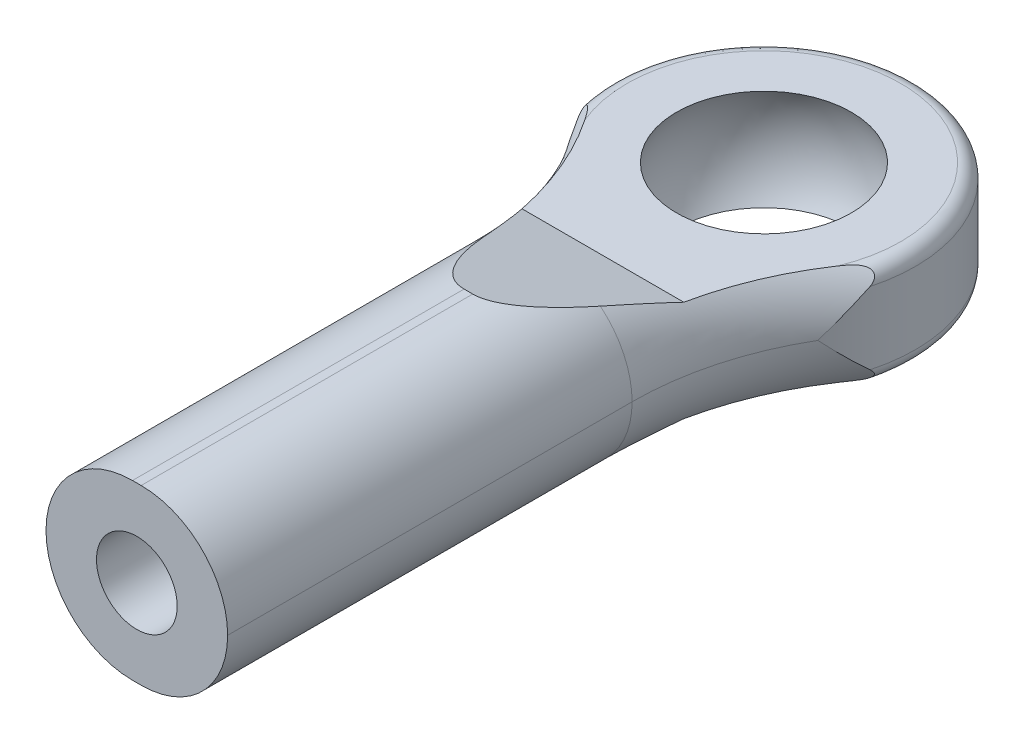
ISO-10303-21;
HEADER;
FILE_DESCRIPTION(('STEP AP214'),'2;1');
FILE_NAME('part.step','',(''),(''),'','','');
FILE_SCHEMA(('AUTOMOTIVE_DESIGN { 1 0 10303 214 1 1 1 1 }'));
ENDSEC;
DATA;
#1=APPLICATION_CONTEXT('core data for automotive mechanical design processes');
#2=APPLICATION_PROTOCOL_DEFINITION('international standard','automotive_design',2000,#1);
#3=PRODUCT_CONTEXT('',#1,'mechanical');
#4=PRODUCT('Part','Part','',(#3));
#5=PRODUCT_RELATED_PRODUCT_CATEGORY('part','',(#4));
#6=PRODUCT_DEFINITION_FORMATION('','',#4);
#7=PRODUCT_DEFINITION_CONTEXT('part definition',#1,'design');
#8=PRODUCT_DEFINITION('design','',#6,#7);
#9=PRODUCT_DEFINITION_SHAPE('','',#8);
#10=(LENGTH_UNIT() NAMED_UNIT(*) SI_UNIT(.MILLI.,.METRE.));
#11=(NAMED_UNIT(*) PLANE_ANGLE_UNIT() SI_UNIT($,.RADIAN.));
#12=(NAMED_UNIT(*) SI_UNIT($,.STERADIAN.) SOLID_ANGLE_UNIT());
#13=UNCERTAINTY_MEASURE_WITH_UNIT(LENGTH_MEASURE(1.E-05),#10,'distance_accuracy_value','');
#14=(GEOMETRIC_REPRESENTATION_CONTEXT(3) GLOBAL_UNCERTAINTY_ASSIGNED_CONTEXT((#13)) GLOBAL_UNIT_ASSIGNED_CONTEXT((#10,
#11,#12)) REPRESENTATION_CONTEXT('',''));
#15=CARTESIAN_POINT('',(0.,0.,0.));
#16=DIRECTION('',(0.,0.,1.));
#17=DIRECTION('',(1.,0.,0.));
#18=AXIS2_PLACEMENT_3D('',#15,#16,#17);
#19=CARTESIAN_POINT('',(0.,3.,0.));
#20=DIRECTION('',(0.,-1.,0.));
#21=DIRECTION('',(0.,0.,-1.));
#22=AXIS2_PLACEMENT_3D('',#19,#20,#21);
#23=CYLINDRICAL_SURFACE('',#22,5.25);
#24=CARTESIAN_POINT('',(5.19236330788863,-1.75,0.775798478273713));
#25=CARTESIAN_POINT('',(5.1792060495885,-1.68319756808274,0.863803332148237));
#26=CARTESIAN_POINT('',(5.16397328935948,-1.6151171445927,0.950501368957418));
#27=CARTESIAN_POINT('',(5.12958951395003,-1.47683559449729,1.1213492053765));
#28=CARTESIAN_POINT('',(5.11043977497422,-1.4066351649523,1.20549982474363));
#29=CARTESIAN_POINT('',(5.06845971366842,-1.26455151885504,1.37132093149753));
#30=CARTESIAN_POINT('',(5.0456318148596,-1.19266943681246,1.45299301016072));
#31=CARTESIAN_POINT('',(4.99645143942483,-1.04752411915998,1.6140192026978));
#32=CARTESIAN_POINT('',(4.97009866492158,-0.974260767272854,1.69337311997912));
#33=CARTESIAN_POINT('',(4.88654424944057,-0.75442988984834,1.92646711768173));
#34=CARTESIAN_POINT('',(4.82439563126691,-0.60630429059596,2.07698892977481));
#35=CARTESIAN_POINT('',(4.68739859515396,-0.308112202894216,2.37000675372814));
#36=CARTESIAN_POINT('',(4.61255402579669,-0.15804631531044,2.51250518037031));
#37=CARTESIAN_POINT('',(4.5299431354514,-0.00533840710561873,2.65369992634006));
#38=CARTESIAN_POINT('',(4.5284971582778,-0.00266919637831573,2.65616671056459));
#39=CARTESIAN_POINT('',(4.52704918032787,0.,2.65863230231124));
#40=B_SPLINE_CURVE_WITH_KNOTS('',3,(#24,#25,#26,#27,#28,#29,#30,#31,#32,#33,#34,#35,#36,#37,#38,
#39),.UNSPECIFIED.,.F.,.F.,(4,2,2,2,2,2,2,4),(0.,0.333738494978038,0.667368426154714,
1.00077942248185,1.33421861225407,1.99403824894354,2.65365822774091,2.66539300371591),.UNSPECIFIED.);
#41=CARTESIAN_POINT('',(4.52704918032787,0.,2.65863230231124));
#42=VERTEX_POINT('',#41);
#43=CARTESIAN_POINT('',(5.06340015992934,-1.25,1.38725585975607));
#44=VERTEX_POINT('',#43);
#45=EDGE_CURVE('E271',#42,#44,#40,.F.);
#46=ORIENTED_EDGE('',*,*,#45,.T.);
#47=CARTESIAN_POINT('',(0.,-1.25,0.));
#48=DIRECTION('',(0.,-1.,0.));
#49=DIRECTION('',(0.,0.,-1.));
#50=AXIS2_PLACEMENT_3D('',#47,#48,#49);
#51=CIRCLE('',#50,5.25);
#52=CARTESIAN_POINT('',(-5.06340015992934,-1.25,1.38725585975607));
#53=VERTEX_POINT('',#52);
#54=EDGE_CURVE('E334',#44,#53,#51,.F.);
#55=ORIENTED_EDGE('',*,*,#54,.T.);
#56=CARTESIAN_POINT('',(-5.19236330788863,-1.75,0.775798478273705));
#57=CARTESIAN_POINT('',(-5.17920604958849,-1.68319756808272,0.863803332148298));
#58=CARTESIAN_POINT('',(-5.16397328935946,-1.61511714459263,0.950501368957524));
#59=CARTESIAN_POINT('',(-5.12958951395,-1.47683559449713,1.12134920537668));
#60=CARTESIAN_POINT('',(-5.11043977497417,-1.40663516495209,1.20549982474384));
#61=CARTESIAN_POINT('',(-5.06845971366836,-1.26455151885488,1.37132093149774));
#62=CARTESIAN_POINT('',(-5.04563181485954,-1.1926694368124,1.45299301016088));
#63=CARTESIAN_POINT('',(-4.99645143942485,-1.04752411915993,1.61401920269776));
#64=CARTESIAN_POINT('',(-4.97009866492168,-0.974260767272721,1.69337311997892));
#65=CARTESIAN_POINT('',(-4.88654424944043,-0.754429889848801,1.92646711768193));
#66=CARTESIAN_POINT('',(-4.82439563126601,-0.606304290598025,2.07698892977632));
#67=CARTESIAN_POINT('',(-4.68739859515492,-0.308112202892274,2.37000675372651));
#68=CARTESIAN_POINT('',(-4.61255402580027,-0.158046315302889,2.51250518036422));
#69=CARTESIAN_POINT('',(-4.52994313545152,-0.00533840710533392,2.65369992633986));
#70=CARTESIAN_POINT('',(-4.52849715827786,-0.00266919637817126,2.65616671056449));
#71=CARTESIAN_POINT('',(-4.52704918032787,0.,2.65863230231124));
#72=B_SPLINE_CURVE_WITH_KNOTS('',3,(#56,#57,#58,#59,#60,#61,#62,#63,#64,#65,#66,#67,#68,#69,#70,
#71),.UNSPECIFIED.,.F.,.F.,(4,2,2,2,2,2,2,4),(0.,0.33373849497824,0.667368426155072,
1.00077942248195,1.33421861225392,1.99403824894344,2.65365822774096,2.66539300371591),.UNSPECIFIED.);
#73=CARTESIAN_POINT('',(-4.52704918032787,0.,2.65863230231124));
#74=VERTEX_POINT('',#73);
#75=EDGE_CURVE('E278',#53,#74,#72,.T.);
#76=ORIENTED_EDGE('',*,*,#75,.T.);
#77=CARTESIAN_POINT('',(-5.19236330788864,1.75,0.7757984782737));
#78=CARTESIAN_POINT('',(-5.17920604958851,1.68319756808276,0.863803332148192));
#79=CARTESIAN_POINT('',(-5.16397328935949,1.61511714459275,0.950501368957346));
#80=CARTESIAN_POINT('',(-5.12958951395006,1.47683559449739,1.12134920537638));
#81=CARTESIAN_POINT('',(-5.11043977497425,1.40663516495242,1.20549982474349));
#82=CARTESIAN_POINT('',(-5.06845971366846,1.26455151885514,1.3713209314974));
#83=CARTESIAN_POINT('',(-5.04563181485964,1.19266943681251,1.45299301016061));
#84=CARTESIAN_POINT('',(-4.99645143942482,1.04752411916002,1.61401920269781));
#85=CARTESIAN_POINT('',(-4.97009866492152,0.97426076727294,1.69337311997924));
#86=CARTESIAN_POINT('',(-4.88654424944065,0.754429889848075,1.92646711768161));
#87=CARTESIAN_POINT('',(-4.82439563126743,0.606304290594754,2.07698892977392));
#88=CARTESIAN_POINT('',(-4.6873985951534,0.308112202895366,2.37000675372911));
#89=CARTESIAN_POINT('',(-4.61255402579459,0.158046315314888,2.5125051803739));
#90=CARTESIAN_POINT('',(-4.52994313545133,0.00533840710578611,2.65369992634017));
#91=CARTESIAN_POINT('',(-4.52849715827776,0.00266919637840063,2.65616671056465));
#92=CARTESIAN_POINT('',(-4.52704918032787,0.,2.65863230231124));
#93=B_SPLINE_CURVE_WITH_KNOTS('',3,(#77,#78,#79,#80,#81,#82,#83,#84,#85,#86,#87,#88,#89,#90,#91,
#92),.UNSPECIFIED.,.F.,.F.,(4,2,2,2,2,2,2,4),(0.,0.333738494977921,0.667368426154508,
1.0007794224818,1.33421861225417,1.99403824894361,2.6536582277409,2.66539300371592),.UNSPECIFIED.);
#94=CARTESIAN_POINT('',(-5.06340015992934,1.25,1.38725585975607));
#95=VERTEX_POINT('',#94);
#96=EDGE_CURVE('E253',#74,#95,#93,.F.);
#97=ORIENTED_EDGE('',*,*,#96,.T.);
#98=CARTESIAN_POINT('',(0.,1.25,0.));
#99=DIRECTION('',(0.,1.,0.));
#100=DIRECTION('',(0.,0.,1.));
#101=AXIS2_PLACEMENT_3D('',#98,#99,#100);
#102=CIRCLE('',#101,5.25);
#103=CARTESIAN_POINT('',(5.06340015992934,1.25,1.38725585975607));
#104=VERTEX_POINT('',#103);
#105=EDGE_CURVE('E375',#95,#104,#102,.F.);
#106=ORIENTED_EDGE('',*,*,#105,.T.);
#107=CARTESIAN_POINT('',(5.19236330788864,1.75,0.775798478273701));
#108=CARTESIAN_POINT('',(5.17920604958849,1.68319756808272,0.863803332148299));
#109=CARTESIAN_POINT('',(5.16397328935946,1.61511714459262,0.950501368957527));
#110=CARTESIAN_POINT('',(5.12958951395,1.47683559449712,1.12134920537669));
#111=CARTESIAN_POINT('',(5.11043977497417,1.40663516495208,1.20549982474385));
#112=CARTESIAN_POINT('',(5.06845971366836,1.26455151885488,1.37132093149775));
#113=CARTESIAN_POINT('',(5.04563181485953,1.19266943681239,1.45299301016089));
#114=CARTESIAN_POINT('',(4.99645143942485,1.04752411915993,1.61401920269776));
#115=CARTESIAN_POINT('',(4.97009866492169,0.974260767272713,1.69337311997891));
#116=CARTESIAN_POINT('',(4.88654424944043,0.754429889848821,1.92646711768194));
#117=CARTESIAN_POINT('',(4.82439563126596,0.606304290598131,2.0769889297764));
#118=CARTESIAN_POINT('',(4.68739859515497,0.308112202892173,2.37000675372643));
#119=CARTESIAN_POINT('',(4.61255402580046,0.158046315302497,2.5125051803639));
#120=CARTESIAN_POINT('',(4.52994313545152,0.00533840710531954,2.65369992633985));
#121=CARTESIAN_POINT('',(4.52849715827786,0.00266919637816396,2.65616671056448));
#122=CARTESIAN_POINT('',(4.52704918032787,0.,2.65863230231124));
#123=B_SPLINE_CURVE_WITH_KNOTS('',3,(#107,#108,#109,#110,#111,#112,#113,#114,#115,#116,#117,
#118,#119,#120,#121,#122),.UNSPECIFIED.,.F.,.F.,(4,2,2,2,2,2,2,4),(0.,0.333738494978251,
0.66736842615509,1.00077942248195,1.33421861225392,1.99403824894344,2.65365822774096,
2.66539300371592),.UNSPECIFIED.);
#124=EDGE_CURVE('E246',#104,#42,#123,.T.);
#125=ORIENTED_EDGE('',*,*,#124,.T.);
#126=EDGE_LOOP('',(#46,#55,#76,#97,#106,#125));
#127=FACE_BOUND('',#126,.T.);
#128=ADVANCED_FACE('F43',(#127),#23,.T.);
#129=CARTESIAN_POINT('',(0.,-3.,0.));
#130=DIRECTION('',(0.,-1.,0.));
#131=DIRECTION('',(0.,0.,1.));
#132=AXIS2_PLACEMENT_3D('',#129,#130,#131);
#133=PLANE('',#132);
#134=DIRECTION('',(1.,0.,0.));
#135=VECTOR('',#134,1.);
#136=CARTESIAN_POINT('',(-3.15,-3.,21.75));
#137=LINE('',#136,#135);
#138=CARTESIAN_POINT('',(-0.15,-3.,21.75));
#139=VERTEX_POINT('',#138);
#140=CARTESIAN_POINT('',(0.15,-3.,21.75));
#141=VERTEX_POINT('',#140);
#142=EDGE_CURVE('E167',#139,#141,#137,.T.);
#143=ORIENTED_EDGE('',*,*,#142,.F.);
#144=DIRECTION('',(0.,0.,1.));
#145=VECTOR('',#144,1.);
#146=CARTESIAN_POINT('',(-0.150000000000004,-3.,0.));
#147=LINE('',#146,#145);
#148=CARTESIAN_POINT('',(-0.150000000000002,-3.,10.25));
#149=VERTEX_POINT('',#148);
#150=EDGE_CURVE('E305',#139,#149,#147,.F.);
#151=ORIENTED_EDGE('',*,*,#150,.T.);
#152=DIRECTION('',(1.,0.,0.));
#153=VECTOR('',#152,1.);
#154=CARTESIAN_POINT('',(0.,-3.,10.25));
#155=LINE('',#154,#153);
#156=CARTESIAN_POINT('',(0.150000000000002,-3.,10.25));
#157=VERTEX_POINT('',#156);
#158=EDGE_CURVE('E406',#149,#157,#155,.T.);
#159=ORIENTED_EDGE('',*,*,#158,.T.);
#160=DIRECTION('',(0.,0.,-1.));
#161=VECTOR('',#160,1.);
#162=CARTESIAN_POINT('',(0.150000000000004,-3.,0.));
#163=LINE('',#162,#161);
#164=EDGE_CURVE('E416',#157,#141,#163,.F.);
#165=ORIENTED_EDGE('',*,*,#164,.T.);
#166=EDGE_LOOP('',(#143,#151,#159,#165));
#167=FACE_BOUND('',#166,.T.);
#168=ADVANCED_FACE('F263',(#167),#133,.T.);
#169=CARTESIAN_POINT('',(-3.15,3.,21.75));
#170=DIRECTION('',(0.,0.,-1.));
#171=DIRECTION('',(-1.,0.,0.));
#172=AXIS2_PLACEMENT_3D('',#169,#170,#171);
#173=PLANE('',#172);
#174=CARTESIAN_POINT('',(0.,0.,21.75));
#175=DIRECTION('',(0.,0.,1.));
#176=DIRECTION('',(1.,0.,0.));
#177=AXIS2_PLACEMENT_3D('',#174,#175,#176);
#178=CIRCLE('',#177,1.4);
#179=CARTESIAN_POINT('',(1.4,0.,21.75));
#180=VERTEX_POINT('',#179);
#181=EDGE_CURVE('E352',#180,#180,#178,.T.);
#182=ORIENTED_EDGE('',*,*,#181,.F.);
#183=EDGE_LOOP('',(#182));
#184=FACE_BOUND('',#183,.T.);
#185=CARTESIAN_POINT('',(-0.15,0.,21.75));
#186=DIRECTION('',(0.,0.,-1.));
#187=DIRECTION('',(-1.,0.,0.));
#188=AXIS2_PLACEMENT_3D('',#185,#186,#187);
#189=CIRCLE('',#188,3.);
#190=CARTESIAN_POINT('',(-0.15,3.,21.75));
#191=VERTEX_POINT('',#190);
#192=CARTESIAN_POINT('',(-3.15,0.,21.75));
#193=VERTEX_POINT('',#192);
#194=EDGE_CURVE('E183',#191,#193,#189,.F.);
#195=ORIENTED_EDGE('',*,*,#194,.T.);
#196=CARTESIAN_POINT('',(-0.15,0.,21.75));
#197=DIRECTION('',(0.,0.,-1.));
#198=DIRECTION('',(-1.,0.,0.));
#199=AXIS2_PLACEMENT_3D('',#196,#197,#198);
#200=CIRCLE('',#199,3.);
#201=EDGE_CURVE('E171',#193,#139,#200,.F.);
#202=ORIENTED_EDGE('',*,*,#201,.T.);
#203=ORIENTED_EDGE('',*,*,#142,.T.);
#204=CARTESIAN_POINT('',(0.15,0.,21.75));
#205=DIRECTION('',(0.,0.,-1.));
#206=DIRECTION('',(-1.,0.,0.));
#207=AXIS2_PLACEMENT_3D('',#204,#205,#206);
#208=CIRCLE('',#207,3.);
#209=CARTESIAN_POINT('',(3.15,0.,21.75));
#210=VERTEX_POINT('',#209);
#211=EDGE_CURVE('E160',#141,#210,#208,.F.);
#212=ORIENTED_EDGE('',*,*,#211,.T.);
#213=CARTESIAN_POINT('',(0.15,0.,21.75));
#214=DIRECTION('',(0.,0.,-1.));
#215=DIRECTION('',(-1.,0.,0.));
#216=AXIS2_PLACEMENT_3D('',#213,#214,#215);
#217=CIRCLE('',#216,3.);
#218=CARTESIAN_POINT('',(0.15,3.,21.75));
#219=VERTEX_POINT('',#218);
#220=EDGE_CURVE('E164',#210,#219,#217,.F.);
#221=ORIENTED_EDGE('',*,*,#220,.T.);
#222=DIRECTION('',(1.,0.,0.));
#223=VECTOR('',#222,1.);
#224=CARTESIAN_POINT('',(-3.15,3.,21.75));
#225=LINE('',#224,#223);
#226=EDGE_CURVE('E191',#191,#219,#225,.T.);
#227=ORIENTED_EDGE('',*,*,#226,.F.);
#228=EDGE_LOOP('',(#195,#202,#203,#212,#221,#227));
#229=FACE_BOUND('',#228,.T.);
#230=ADVANCED_FACE('F162',(#184,#229),#173,.F.);
#231=CARTESIAN_POINT('',(0.,3.,0.));
#232=DIRECTION('',(0.,1.,0.));
#233=DIRECTION('',(0.,0.,1.));
#234=AXIS2_PLACEMENT_3D('',#231,#232,#233);
#235=PLANE('',#234);
#236=DIRECTION('',(-1.,0.,0.));
#237=VECTOR('',#236,1.);
#238=CARTESIAN_POINT('',(-3.46053225298248,3.,10.25));
#239=LINE('',#238,#237);
#240=CARTESIAN_POINT('',(0.150000000000002,3.,10.25));
#241=VERTEX_POINT('',#240);
#242=CARTESIAN_POINT('',(-0.150000000000002,3.,10.25));
#243=VERTEX_POINT('',#242);
#244=EDGE_CURVE('E207',#241,#243,#239,.T.);
#245=ORIENTED_EDGE('',*,*,#244,.T.);
#246=DIRECTION('',(0.,0.,1.));
#247=VECTOR('',#246,1.);
#248=CARTESIAN_POINT('',(-0.15,3.,21.75));
#249=LINE('',#248,#247);
#250=EDGE_CURVE('E184',#243,#191,#249,.T.);
#251=ORIENTED_EDGE('',*,*,#250,.T.);
#252=ORIENTED_EDGE('',*,*,#226,.T.);
#253=DIRECTION('',(0.,0.,-1.));
#254=VECTOR('',#253,1.);
#255=CARTESIAN_POINT('',(0.150000000000002,3.,10.25));
#256=LINE('',#255,#254);
#257=EDGE_CURVE('E182',#219,#241,#256,.T.);
#258=ORIENTED_EDGE('',*,*,#257,.T.);
#259=EDGE_LOOP('',(#245,#251,#252,#258));
#260=FACE_BOUND('',#259,.T.);
#261=ADVANCED_FACE('F428',(#260),#235,.T.);
#262=CARTESIAN_POINT('',(0.,1.75,0.));
#263=DIRECTION('',(0.,1.,0.));
#264=DIRECTION('',(0.,0.,1.));
#265=AXIS2_PLACEMENT_3D('',#262,#263,#264);
#266=PLANE('',#265);
#267=CARTESIAN_POINT('',(0.,1.75,0.));
#268=DIRECTION('',(0.,1.,0.));
#269=DIRECTION('',(0.,0.,1.));
#270=AXIS2_PLACEMENT_3D('',#267,#268,#269);
#271=CIRCLE('',#270,3.03108891324554);
#272=CARTESIAN_POINT('',(0.,1.75,-3.03108891324554));
#273=VERTEX_POINT('',#272);
#274=EDGE_CURVE('E194',#273,#273,#271,.F.);
#275=ORIENTED_EDGE('',*,*,#274,.T.);
#276=EDGE_LOOP('',(#275));
#277=FACE_BOUND('',#276,.T.);
#278=CARTESIAN_POINT('',(13.15,1.75,7.72269383052313));
#279=DIRECTION('',(0.,1.,0.));
#280=DIRECTION('',(0.,0.,1.));
#281=AXIS2_PLACEMENT_3D('',#278,#279,#280);
#282=CIRCLE('',#281,10.5633014137978);
#283=CARTESIAN_POINT('',(2.80527524222679,1.75,5.58493649053905));
#284=VERTEX_POINT('',#283);
#285=CARTESIAN_POINT('',(4.38380171285945,1.75,1.82887466556092));
#286=VERTEX_POINT('',#285);
#287=EDGE_CURVE('E395',#284,#286,#282,.F.);
#288=ORIENTED_EDGE('',*,*,#287,.T.);
#289=CARTESIAN_POINT('',(0.,1.75,0.));
#290=DIRECTION('',(0.,1.,0.));
#291=DIRECTION('',(0.,0.,1.));
#292=AXIS2_PLACEMENT_3D('',#289,#290,#291);
#293=CIRCLE('',#292,4.75);
#294=CARTESIAN_POINT('',(-4.38380171285945,1.75,1.82887466556092));
#295=VERTEX_POINT('',#294);
#296=EDGE_CURVE('E366',#286,#295,#293,.T.);
#297=ORIENTED_EDGE('',*,*,#296,.T.);
#298=CARTESIAN_POINT('',(-13.15,1.75,7.72269383052313));
#299=DIRECTION('',(0.,1.,0.));
#300=DIRECTION('',(0.,0.,1.));
#301=AXIS2_PLACEMENT_3D('',#298,#299,#300);
#302=CIRCLE('',#301,10.5633014137978);
#303=CARTESIAN_POINT('',(-2.8052752422268,1.75,5.58493649053905));
#304=VERTEX_POINT('',#303);
#305=EDGE_CURVE('E364',#295,#304,#302,.F.);
#306=ORIENTED_EDGE('',*,*,#305,.T.);
#307=DIRECTION('',(1.,0.,0.));
#308=VECTOR('',#307,1.);
#309=CARTESIAN_POINT('',(-3.15,1.75,5.58493649053905));
#310=LINE('',#309,#308);
#311=EDGE_CURVE('E210',#304,#284,#310,.T.);
#312=ORIENTED_EDGE('',*,*,#311,.T.);
#313=EDGE_LOOP('',(#288,#297,#306,#312));
#314=FACE_BOUND('',#313,.T.);
#315=ADVANCED_FACE('F430',(#277,#314),#266,.T.);
#316=CARTESIAN_POINT('',(0.,0.,0.));
#317=DIRECTION('',(0.,1.,0.));
#318=DIRECTION('',(0.,0.,-1.));
#319=AXIS2_PLACEMENT_3D('',#316,#317,#318);
#320=SPHERICAL_SURFACE('',#319,3.5);
#321=CARTESIAN_POINT('',(0.,0.,0.));
#322=DIRECTION('',(1.,0.,0.));
#323=DIRECTION('',(0.,0.,-1.));
#324=AXIS2_PLACEMENT_3D('',#321,#322,#323);
#325=CIRCLE('',#324,3.5);
#326=CARTESIAN_POINT('',(0.,-1.75,-3.03108891324554));
#327=VERTEX_POINT('',#326);
#328=EDGE_CURVE('E197',#327,#273,#325,.T.);
#329=ORIENTED_EDGE('',*,*,#328,.F.);
#330=CARTESIAN_POINT('',(0.,-1.75,0.));
#331=DIRECTION('',(0.,-1.,0.));
#332=DIRECTION('',(0.,0.,-1.));
#333=AXIS2_PLACEMENT_3D('',#330,#331,#332);
#334=CIRCLE('',#333,3.03108891324554);
#335=EDGE_CURVE('E404',#327,#327,#334,.F.);
#336=ORIENTED_EDGE('',*,*,#335,.F.);
#337=ORIENTED_EDGE('',*,*,#328,.T.);
#338=ORIENTED_EDGE('',*,*,#274,.F.);
#339=EDGE_LOOP('',(#329,#336,#337,#338));
#340=FACE_BOUND('',#339,.T.);
#341=ADVANCED_FACE('F435',(#340),#320,.F.);
#342=CARTESIAN_POINT('',(-3.15,1.66025403784435,5.25));
#343=DIRECTION('',(0.,0.965925826289066,-0.258819045102528));
#344=DIRECTION('',(-1.,0.,0.));
#345=AXIS2_PLACEMENT_3D('',#342,#343,#344);
#346=PLANE('',#345);
#347=CARTESIAN_POINT('',(-2.8052752422268,1.75,5.58493649053905));
#348=CARTESIAN_POINT('',(-2.73446276507972,1.79703130626624,5.76045971507097));
#349=CARTESIAN_POINT('',(-2.66627798819124,1.84431996808465,5.93694340359922));
#350=CARTESIAN_POINT('',(-2.53421634220126,1.93928398118941,6.29135392539683));
#351=CARTESIAN_POINT('',(-2.47033821393386,1.98695921484393,6.4692803196582));
#352=CARTESIAN_POINT('',(-2.34591966771724,2.08258246527565,6.82615114865426));
#353=CARTESIAN_POINT('',(-2.2853783028416,2.13053040035842,7.00509527850115));
#354=CARTESIAN_POINT('',(-2.19593704795646,2.20257347234799,7.27396368349957));
#355=CARTESIAN_POINT('',(-2.16634726590962,2.22661177300312,7.36367584287211));
#356=CARTESIAN_POINT('',(-2.10736985306928,2.27470429787319,7.5431595891515));
#357=CARTESIAN_POINT('',(-2.07798221687795,2.298758521644,7.63293117440078));
#358=CARTESIAN_POINT('',(-2.04856579149499,2.32281035286246,7.72269383052312));
#359=B_SPLINE_CURVE_WITH_KNOTS('',3,(#347,#348,#349,#350,#351,#352,#353,#354,#355,#356,#357,
#358),.UNSPECIFIED.,.F.,.F.,(4,2,2,2,2,4),(0.,0.585015670596653,1.16985954745083,
1.75453659011686,2.04696609663337,2.33938776395241),.UNSPECIFIED.);
#360=CARTESIAN_POINT('',(-2.04856579149499,2.32281035286246,7.72269383052312));
#361=VERTEX_POINT('',#360);
#362=EDGE_CURVE('E381',#304,#361,#359,.T.);
#363=ORIENTED_EDGE('',*,*,#362,.T.);
#364=CARTESIAN_POINT('',(-0.150000000000004,0.,-0.946152422706298));
#365=DIRECTION('',(0.,0.965925826289066,-0.258819045102528));
#366=DIRECTION('',(0.,-0.258819045102528,-0.965925826289067));
#367=AXIS2_PLACEMENT_3D('',#364,#365,#366);
#368=ELLIPSE('',#367,11.5911099154685,3.);
#369=EDGE_CURVE('E254',#361,#243,#368,.T.);
#370=ORIENTED_EDGE('',*,*,#369,.T.);
#371=ORIENTED_EDGE('',*,*,#244,.F.);
#372=CARTESIAN_POINT('',(0.150000000000004,0.,-0.946152422706297));
#373=DIRECTION('',(0.,0.965925826289066,-0.258819045102528));
#374=DIRECTION('',(0.,0.258819045102528,0.965925826289067));
#375=AXIS2_PLACEMENT_3D('',#372,#373,#374);
#376=ELLIPSE('',#375,11.5911099154685,3.);
#377=CARTESIAN_POINT('',(2.04856579149499,2.32281035286245,7.72269383052312));
#378=VERTEX_POINT('',#377);
#379=EDGE_CURVE('E224',#241,#378,#376,.T.);
#380=ORIENTED_EDGE('',*,*,#379,.T.);
#381=CARTESIAN_POINT('',(2.04856579149499,2.32281035286245,7.72269383052312));
#382=CARTESIAN_POINT('',(2.07798221687795,2.298758521644,7.63293117440078));
#383=CARTESIAN_POINT('',(2.10736985306928,2.27470429787319,7.54315958915149));
#384=CARTESIAN_POINT('',(2.16634726590962,2.22661177300312,7.36367584287211));
#385=CARTESIAN_POINT('',(2.19593704795646,2.20257347234799,7.27396368349957));
#386=CARTESIAN_POINT('',(2.2853783028416,2.13053040035842,7.00509527850115));
#387=CARTESIAN_POINT('',(2.34591966771725,2.08258246527565,6.82615114865426));
#388=CARTESIAN_POINT('',(2.47033821393386,1.98695921484393,6.46928031965821));
#389=CARTESIAN_POINT('',(2.53421634220126,1.93928398118941,6.29135392539683));
#390=CARTESIAN_POINT('',(2.66627798819124,1.84431996808465,5.93694340359922));
#391=CARTESIAN_POINT('',(2.73446276507972,1.79703130626624,5.76045971507097));
#392=CARTESIAN_POINT('',(2.80527524222679,1.75,5.58493649053905));
#393=B_SPLINE_CURVE_WITH_KNOTS('',3,(#381,#382,#383,#384,#385,#386,#387,#388,#389,#390,#391,
#392),.UNSPECIFIED.,.F.,.F.,(4,2,2,2,2,4),(0.,0.292421667319038,0.584851173835552,
1.16952821650158,1.75437209335575,2.33938776395241),.UNSPECIFIED.);
#394=EDGE_CURVE('E216',#378,#284,#393,.T.);
#395=ORIENTED_EDGE('',*,*,#394,.T.);
#396=ORIENTED_EDGE('',*,*,#311,.F.);
#397=EDGE_LOOP('',(#363,#370,#371,#380,#395,#396));
#398=FACE_BOUND('',#397,.T.);
#399=ADVANCED_FACE('F227',(#398),#346,.T.);
#400=CARTESIAN_POINT('',(-0.150000000000004,0.,0.));
#401=DIRECTION('',(0.,0.,-1.));
#402=DIRECTION('',(-1.,0.,0.));
#403=AXIS2_PLACEMENT_3D('',#400,#401,#402);
#404=CYLINDRICAL_SURFACE('',#403,3.);
#405=ORIENTED_EDGE('',*,*,#250,.F.);
#406=ORIENTED_EDGE('',*,*,#369,.F.);
#407=CARTESIAN_POINT('',(-0.150000000000003,0.,7.72269383052312));
#408=DIRECTION('',(0.,0.,-1.));
#409=DIRECTION('',(-1.,0.,0.));
#410=AXIS2_PLACEMENT_3D('',#407,#408,#409);
#411=CIRCLE('',#410,3.);
#412=CARTESIAN_POINT('',(-3.15,0.,7.72269383052312));
#413=VERTEX_POINT('',#412);
#414=EDGE_CURVE('E348',#413,#361,#411,.T.);
#415=ORIENTED_EDGE('',*,*,#414,.F.);
#416=DIRECTION('',(0.,0.,1.));
#417=VECTOR('',#416,1.);
#418=CARTESIAN_POINT('',(-3.15,0.,4.2));
#419=LINE('',#418,#417);
#420=EDGE_CURVE('E192',#413,#193,#419,.T.);
#421=ORIENTED_EDGE('',*,*,#420,.T.);
#422=ORIENTED_EDGE('',*,*,#194,.F.);
#423=EDGE_LOOP('',(#405,#406,#415,#421,#422));
#424=FACE_BOUND('',#423,.T.);
#425=ADVANCED_FACE('F378',(#424),#404,.T.);
#426=CARTESIAN_POINT('',(-13.15,0.,7.72269383052313));
#427=DIRECTION('',(0.,1.,0.));
#428=DIRECTION('',(0.,0.,1.));
#429=AXIS2_PLACEMENT_3D('',#426,#427,#428);
#430=TOROIDAL_SURFACE('',#429,13.,3.);
#431=ORIENTED_EDGE('',*,*,#305,.F.);
#432=CARTESIAN_POINT('',(-4.38380171285945,1.75,1.82887466556092));
#433=CARTESIAN_POINT('',(-4.39810324668092,1.74999790947627,1.80760572099098));
#434=CARTESIAN_POINT('',(-4.41252513298993,1.74992498861586,1.78641646651927));
#435=CARTESIAN_POINT('',(-4.44165730381276,1.7495578763346,1.74422798794034));
#436=CARTESIAN_POINT('',(-4.45636769136254,1.74926360440493,1.72322883578937));
#437=CARTESIAN_POINT('',(-4.5013752536106,1.74791770023649,1.66004128251389));
#438=CARTESIAN_POINT('',(-4.53217814213271,1.74639877819682,1.61821960241566));
#439=CARTESIAN_POINT('',(-4.59603961123211,1.74109496706388,1.53551083013139));
#440=CARTESIAN_POINT('',(-4.62912292358925,1.73727992996993,1.49464382339829));
#441=CARTESIAN_POINT('',(-4.68054980285553,1.72842458202315,1.43554083218246));
#442=CARTESIAN_POINT('',(-4.69794523808475,1.72496359551266,1.41625304017278));
#443=CARTESIAN_POINT('',(-4.73344017955647,1.71661271838619,1.3786705098863));
#444=CARTESIAN_POINT('',(-4.75153899190512,1.71172420651127,1.36037483352072));
#445=CARTESIAN_POINT('',(-4.78413477069251,1.70136905565006,1.32937654690095));
#446=CARTESIAN_POINT('',(-4.79847273419588,1.69631171315694,1.31637358950528));
#447=CARTESIAN_POINT('',(-4.82760532664677,1.68470423614431,1.29151383692696));
#448=CARTESIAN_POINT('',(-4.84240071653947,1.67815148406669,1.27965910404369));
#449=CARTESIAN_POINT('',(-4.8724871470485,1.6630475068379,1.25749022683974));
#450=CARTESIAN_POINT('',(-4.88778203334612,1.65447286348841,1.2471966542395));
#451=CARTESIAN_POINT('',(-4.91831056837565,1.63488172865756,1.22914765429579));
#452=CARTESIAN_POINT('',(-4.93354423672124,1.62387427097309,1.22138309315564));
#453=CARTESIAN_POINT('',(-4.95776763845896,1.60362497060619,1.21159910253285));
#454=CARTESIAN_POINT('',(-4.96700918282245,1.59520221352445,1.20851717141229));
#455=CARTESIAN_POINT('',(-4.98484346435696,1.57728273660922,1.20405366521332));
#456=CARTESIAN_POINT('',(-4.99343680986482,1.56778704517804,1.20267047674459));
#457=CARTESIAN_POINT('',(-5.00967582482233,1.54784836970352,1.20176746935087));
#458=CARTESIAN_POINT('',(-5.0173165479557,1.53740089227809,1.20225698932542));
#459=CARTESIAN_POINT('',(-5.03130941869739,1.5159137294211,1.20511371236646));
#460=CARTESIAN_POINT('',(-5.03766111424981,1.50487383794301,1.20748157273396));
#461=CARTESIAN_POINT('',(-5.04858199323749,1.48324763836647,1.21371284074054));
#462=CARTESIAN_POINT('',(-5.05323613443763,1.47267461660472,1.21747645829974));
#463=CARTESIAN_POINT('',(-5.06127991940308,1.45158415454514,1.22626010937031));
#464=CARTESIAN_POINT('',(-5.06466970417093,1.44106670817852,1.23128000267592));
#465=CARTESIAN_POINT('',(-5.07169185849753,1.41497760602828,1.24514528031934));
#466=CARTESIAN_POINT('',(-5.07457442826052,1.39954951170306,1.25463925548076));
#467=CARTESIAN_POINT('',(-5.07808811743292,1.36949387379061,1.27528014975883));
#468=CARTESIAN_POINT('',(-5.07870654393551,1.35487129472051,1.28643602382951));
#469=CARTESIAN_POINT('',(-5.07804984196444,1.32415346989306,1.31190400523172));
#470=CARTESIAN_POINT('',(-5.07642576613714,1.30824597303852,1.32642728394476));
#471=CARTESIAN_POINT('',(-5.07121873481135,1.27801806644224,1.35630365317647));
#472=CARTESIAN_POINT('',(-5.06766469686396,1.26367789189763,1.3716415503324));
#473=CARTESIAN_POINT('',(-5.06340015992934,1.25,1.38725585975607));
#474=B_SPLINE_CURVE_WITH_KNOTS('',3,(#432,#433,#434,#435,#436,#437,#438,#439,#440,#441,#442,
#443,#444,#445,#446,#447,#448,#449,#450,#451,#452,#453,#454,#455,#456,#457,#458,#459,#460,#461,
#462,#463,#464,#465,#466,#467,#468,#469,#470,#471,#472,#473),.UNSPECIFIED.,.F.,.F.,(4,2,2,2,2,2,
2,2,2,2,2,2,2,2,2,2,2,2,2,2,4),(0.,0.0768911140228442,0.153810208068026,0.309653865900961,
0.467589805329679,0.546153459307387,0.624641484024612,0.684590348057276,0.744644962288214,
0.805432639305932,0.86599827587796,0.9044858153434,0.942936772714315,0.981579728260462,
1.02023621237906,1.0565400485462,1.09283983485476,1.14756007506857,1.20258661414555,
1.2672072171744,1.33088527027752),.UNSPECIFIED.);
#475=EDGE_CURVE('E369',#295,#95,#474,.T.);
#476=ORIENTED_EDGE('',*,*,#475,.T.);
#477=ORIENTED_EDGE('',*,*,#96,.F.);
#478=CARTESIAN_POINT('',(-13.15,0.,7.72269383052313));
#479=DIRECTION('',(0.,1.,0.));
#480=DIRECTION('',(0.,0.,1.));
#481=AXIS2_PLACEMENT_3D('',#478,#479,#480);
#482=CIRCLE('',#481,10.);
#483=EDGE_CURVE('E202',#413,#74,#482,.T.);
#484=ORIENTED_EDGE('',*,*,#483,.F.);
#485=ORIENTED_EDGE('',*,*,#414,.T.);
#486=ORIENTED_EDGE('',*,*,#362,.F.);
#487=EDGE_LOOP('',(#431,#476,#477,#484,#485,#486));
#488=FACE_BOUND('',#487,.T.);
#489=ADVANCED_FACE('F236',(#488),#430,.T.);
#490=CARTESIAN_POINT('',(13.15,0.,7.72269383052313));
#491=DIRECTION('',(0.,1.,0.));
#492=DIRECTION('',(0.,0.,1.));
#493=AXIS2_PLACEMENT_3D('',#490,#491,#492);
#494=TOROIDAL_SURFACE('',#493,13.,3.);
#495=ORIENTED_EDGE('',*,*,#124,.F.);
#496=CARTESIAN_POINT('',(5.06340015992934,1.25,1.38725585975607));
#497=CARTESIAN_POINT('',(5.0678882246392,1.26440420052789,1.3708153767909));
#498=CARTESIAN_POINT('',(5.07159403177342,1.27955097512704,1.35466905552071));
#499=CARTESIAN_POINT('',(5.07686204809132,1.31155326091536,1.32330167766968));
#500=CARTESIAN_POINT('',(5.07839161301035,1.32843080363366,1.30809791854386));
#501=CARTESIAN_POINT('',(5.07853918100551,1.35985345006322,1.28258966820527));
#502=CARTESIAN_POINT('',(5.07771836760708,1.37410682838736,1.27193903056606));
#503=CARTESIAN_POINT('',(5.0739045790335,1.40335705636727,1.25225406659731));
#504=CARTESIAN_POINT('',(5.07092244040039,1.41834985052556,1.24321195599494));
#505=CARTESIAN_POINT('',(5.06348710478265,1.44498059097748,1.22933168021041));
#506=CARTESIAN_POINT('',(5.05958964456535,1.45651797548394,1.22400783314984));
#507=CARTESIAN_POINT('',(5.0502704265575,1.47960471156806,1.21492296904193));
#508=CARTESIAN_POINT('',(5.04484931041406,1.49115405607365,1.21116129577528));
#509=CARTESIAN_POINT('',(5.03247359797054,1.51398491364101,1.20547272992113));
#510=CARTESIAN_POINT('',(5.02550978429243,1.52526434508489,1.20355725263004));
#511=CARTESIAN_POINT('',(5.0102811702935,1.54708221720145,1.20175857751686));
#512=CARTESIAN_POINT('',(5.00201649060444,1.55762072645027,1.20187519136502));
#513=CARTESIAN_POINT('',(4.98535262509022,1.57671890172577,1.20397690127053));
#514=CARTESIAN_POINT('',(4.97703600380809,1.58537142887562,1.20578883869393));
#515=CARTESIAN_POINT('',(4.9599124123985,1.6017003127111,1.21085980591536));
#516=CARTESIAN_POINT('',(4.95110531808085,1.60937642053192,1.21411920368784));
#517=CARTESIAN_POINT('',(4.92846743550588,1.62759014002948,1.22392726703256));
#518=CARTESIAN_POINT('',(4.91446549739959,1.63746677635294,1.23130296009776));
#519=CARTESIAN_POINT('',(4.88643727486082,1.6551931069198,1.24813508683849));
#520=CARTESIAN_POINT('',(4.8724110242001,1.66303736203814,1.25759698108018));
#521=CARTESIAN_POINT('',(4.83354103042538,1.68268098628913,1.28610173826926));
#522=CARTESIAN_POINT('',(4.80898601516609,1.69264934451597,1.30677003412443));
#523=CARTESIAN_POINT('',(4.76099654078543,1.70915626149168,1.35083724963094));
#524=CARTESIAN_POINT('',(4.73757335602384,1.71566500400224,1.37425784843465));
#525=CARTESIAN_POINT('',(4.68319057484544,1.72839952653031,1.43192762646068));
#526=CARTESIAN_POINT('',(4.65276410594612,1.73357046283957,1.46689976366276));
#527=CARTESIAN_POINT('',(4.59361380356439,1.74134343076009,1.53861214577569));
#528=CARTESIAN_POINT('',(4.56489488114111,1.74393836056785,1.57535698742019));
#529=CARTESIAN_POINT('',(4.51023578152643,1.7474997619328,1.64800413843384));
#530=CARTESIAN_POINT('',(4.48422862887309,1.74854290246246,1.68385305864966));
#531=CARTESIAN_POINT('',(4.43330577605214,1.74977422907071,1.75602798267382));
#532=CARTESIAN_POINT('',(4.40838466257613,1.74996729379574,1.79235006100596));
#533=CARTESIAN_POINT('',(4.38380171285936,1.75000000000022,1.82887466556079));
#534=B_SPLINE_CURVE_WITH_KNOTS('',3,(#496,#497,#498,#499,#500,#501,#502,#503,#504,#505,#506,
#507,#508,#509,#510,#511,#512,#513,#514,#515,#516,#517,#518,#519,#520,#521,#522,#523,#524,#525,
#526,#527,#528,#529,#530,#531,#532,#533),.UNSPECIFIED.,.F.,.F.,(4,2,2,2,2,2,2,2,2,2,2,2,2,2,2,2,
2,2,4),(0.,0.0670819356162954,0.13515987787284,0.188422477566759,0.241419858342911,
0.281139488084996,0.320842415960997,0.360789287185066,0.400732456240226,0.436995121000676,
0.473267009764701,0.528908972118551,0.584698342049655,0.684955072198803,0.786062389207461,
0.925734374570332,1.06579036165617,1.19866578273861,1.33077761983851),.UNSPECIFIED.);
#535=EDGE_CURVE('E397',#104,#286,#534,.T.);
#536=ORIENTED_EDGE('',*,*,#535,.T.);
#537=ORIENTED_EDGE('',*,*,#287,.F.);
#538=ORIENTED_EDGE('',*,*,#394,.F.);
#539=CARTESIAN_POINT('',(0.150000000000003,0.,7.72269383052312));
#540=DIRECTION('',(0.,0.,1.));
#541=DIRECTION('',(1.,0.,0.));
#542=AXIS2_PLACEMENT_3D('',#539,#540,#541);
#543=CIRCLE('',#542,3.);
#544=CARTESIAN_POINT('',(3.15,0.,7.72269383052312));
#545=VERTEX_POINT('',#544);
#546=EDGE_CURVE('E346',#545,#378,#543,.T.);
#547=ORIENTED_EDGE('',*,*,#546,.F.);
#548=CARTESIAN_POINT('',(13.15,0.,7.72269383052313));
#549=DIRECTION('',(0.,1.,0.));
#550=DIRECTION('',(0.,0.,1.));
#551=AXIS2_PLACEMENT_3D('',#548,#549,#550);
#552=CIRCLE('',#551,10.);
#553=EDGE_CURVE('E205',#42,#545,#552,.T.);
#554=ORIENTED_EDGE('',*,*,#553,.F.);
#555=EDGE_LOOP('',(#495,#536,#537,#538,#547,#554));
#556=FACE_BOUND('',#555,.T.);
#557=ADVANCED_FACE('F231',(#556),#494,.T.);
#558=CARTESIAN_POINT('',(0.150000000000004,0.,0.));
#559=DIRECTION('',(0.,0.,1.));
#560=DIRECTION('',(1.,0.,0.));
#561=AXIS2_PLACEMENT_3D('',#558,#559,#560);
#562=CYLINDRICAL_SURFACE('',#561,3.);
#563=ORIENTED_EDGE('',*,*,#220,.F.);
#564=DIRECTION('',(0.,0.,-1.));
#565=VECTOR('',#564,1.);
#566=CARTESIAN_POINT('',(3.15,0.,4.2));
#567=LINE('',#566,#565);
#568=EDGE_CURVE('E179',#210,#545,#567,.T.);
#569=ORIENTED_EDGE('',*,*,#568,.T.);
#570=ORIENTED_EDGE('',*,*,#546,.T.);
#571=ORIENTED_EDGE('',*,*,#379,.F.);
#572=ORIENTED_EDGE('',*,*,#257,.F.);
#573=EDGE_LOOP('',(#563,#569,#570,#571,#572));
#574=FACE_BOUND('',#573,.T.);
#575=ADVANCED_FACE('F177',(#574),#562,.T.);
#576=CARTESIAN_POINT('',(0.,1.25,0.));
#577=DIRECTION('',(0.,1.,0.));
#578=DIRECTION('',(0.,0.,1.));
#579=AXIS2_PLACEMENT_3D('',#576,#577,#578);
#580=TOROIDAL_SURFACE('',#579,4.75,0.5);
#581=ORIENTED_EDGE('',*,*,#535,.F.);
#582=ORIENTED_EDGE('',*,*,#105,.F.);
#583=ORIENTED_EDGE('',*,*,#475,.F.);
#584=ORIENTED_EDGE('',*,*,#296,.F.);
#585=EDGE_LOOP('',(#581,#582,#583,#584));
#586=FACE_BOUND('',#585,.T.);
#587=ADVANCED_FACE('F239',(#586),#580,.T.);
#588=CARTESIAN_POINT('',(0.,-1.75,0.));
#589=DIRECTION('',(0.,-1.,0.));
#590=DIRECTION('',(0.,0.,1.));
#591=AXIS2_PLACEMENT_3D('',#588,#589,#590);
#592=PLANE('',#591);
#593=ORIENTED_EDGE('',*,*,#335,.T.);
#594=EDGE_LOOP('',(#593));
#595=FACE_BOUND('',#594,.T.);
#596=CARTESIAN_POINT('',(-13.15,-1.75,7.72269383052313));
#597=DIRECTION('',(0.,-1.,0.));
#598=DIRECTION('',(0.,0.,-1.));
#599=AXIS2_PLACEMENT_3D('',#596,#597,#598);
#600=CIRCLE('',#599,10.5633014137978);
#601=CARTESIAN_POINT('',(-2.8052752422268,-1.75,5.58493649053905));
#602=VERTEX_POINT('',#601);
#603=CARTESIAN_POINT('',(-4.38380171285945,-1.75,1.82887466556092));
#604=VERTEX_POINT('',#603);
#605=EDGE_CURVE('E279',#602,#604,#600,.F.);
#606=ORIENTED_EDGE('',*,*,#605,.T.);
#607=CARTESIAN_POINT('',(0.,-1.75,0.));
#608=DIRECTION('',(0.,-1.,0.));
#609=DIRECTION('',(0.,0.,-1.));
#610=AXIS2_PLACEMENT_3D('',#607,#608,#609);
#611=CIRCLE('',#610,4.75);
#612=CARTESIAN_POINT('',(4.38380171285944,-1.75,1.82887466556093));
#613=VERTEX_POINT('',#612);
#614=EDGE_CURVE('E56',#604,#613,#611,.T.);
#615=ORIENTED_EDGE('',*,*,#614,.T.);
#616=CARTESIAN_POINT('',(13.15,-1.75,7.72269383052313));
#617=DIRECTION('',(0.,-1.,0.));
#618=DIRECTION('',(0.,0.,-1.));
#619=AXIS2_PLACEMENT_3D('',#616,#617,#618);
#620=CIRCLE('',#619,10.5633014137978);
#621=CARTESIAN_POINT('',(2.8052752422268,-1.75,5.58493649053905));
#622=VERTEX_POINT('',#621);
#623=EDGE_CURVE('E326',#613,#622,#620,.F.);
#624=ORIENTED_EDGE('',*,*,#623,.T.);
#625=DIRECTION('',(1.,0.,0.));
#626=VECTOR('',#625,1.);
#627=CARTESIAN_POINT('',(0.,-1.75,5.58493649053905));
#628=LINE('',#627,#626);
#629=EDGE_CURVE('E172',#622,#602,#628,.F.);
#630=ORIENTED_EDGE('',*,*,#629,.T.);
#631=EDGE_LOOP('',(#606,#615,#624,#630));
#632=FACE_BOUND('',#631,.T.);
#633=ADVANCED_FACE('F315',(#595,#632),#592,.T.);
#634=CARTESIAN_POINT('',(0.,-3.,10.25));
#635=DIRECTION('',(0.,0.965925826289066,0.258819045102528));
#636=DIRECTION('',(1.,0.,0.));
#637=AXIS2_PLACEMENT_3D('',#634,#635,#636);
#638=PLANE('',#637);
#639=ORIENTED_EDGE('',*,*,#158,.F.);
#640=CARTESIAN_POINT('',(-0.150000000000004,0.,-0.946152422706298));
#641=DIRECTION('',(0.,0.965925826289066,0.258819045102528));
#642=DIRECTION('',(0.,-0.258819045102528,0.965925826289067));
#643=AXIS2_PLACEMENT_3D('',#640,#641,#642);
#644=ELLIPSE('',#643,11.5911099154685,3.);
#645=CARTESIAN_POINT('',(-2.04856579149499,-2.32281035286245,7.72269383052312));
#646=VERTEX_POINT('',#645);
#647=EDGE_CURVE('E325',#149,#646,#644,.F.);
#648=ORIENTED_EDGE('',*,*,#647,.T.);
#649=CARTESIAN_POINT('',(-2.04856579149499,-2.32281035286245,7.72269383052312));
#650=CARTESIAN_POINT('',(-2.07798221687795,-2.298758521644,7.63293117440078));
#651=CARTESIAN_POINT('',(-2.10736985306928,-2.27470429787319,7.5431595891515));
#652=CARTESIAN_POINT('',(-2.16634726590962,-2.22661177300312,7.36367584287211));
#653=CARTESIAN_POINT('',(-2.19593704795646,-2.20257347234799,7.27396368349957));
#654=CARTESIAN_POINT('',(-2.2853783028416,-2.13053040035842,7.00509527850115));
#655=CARTESIAN_POINT('',(-2.34591966771724,-2.08258246527565,6.82615114865426));
#656=CARTESIAN_POINT('',(-2.47033821393386,-1.98695921484393,6.4692803196582));
#657=CARTESIAN_POINT('',(-2.53421634220127,-1.93928398118941,6.29135392539683));
#658=CARTESIAN_POINT('',(-2.66627798819124,-1.84431996808465,5.93694340359922));
#659=CARTESIAN_POINT('',(-2.73446276507972,-1.79703130626624,5.76045971507097));
#660=CARTESIAN_POINT('',(-2.80527524222679,-1.75,5.58493649053905));
#661=B_SPLINE_CURVE_WITH_KNOTS('',3,(#649,#650,#651,#652,#653,#654,#655,#656,#657,#658,#659,
#660),.UNSPECIFIED.,.F.,.F.,(4,2,2,2,2,4),(0.,0.292421667319037,0.584851173835552,
1.16952821650158,1.75437209335576,2.33938776395241),.UNSPECIFIED.);
#662=EDGE_CURVE('E319',#646,#602,#661,.T.);
#663=ORIENTED_EDGE('',*,*,#662,.T.);
#664=ORIENTED_EDGE('',*,*,#629,.F.);
#665=CARTESIAN_POINT('',(2.8052752422268,-1.75,5.58493649053905));
#666=CARTESIAN_POINT('',(2.73446276507972,-1.79703130626624,5.76045971507097));
#667=CARTESIAN_POINT('',(2.66627798819124,-1.84431996808465,5.93694340359922));
#668=CARTESIAN_POINT('',(2.53421634220126,-1.93928398118941,6.29135392539683));
#669=CARTESIAN_POINT('',(2.47033821393386,-1.98695921484393,6.46928031965821));
#670=CARTESIAN_POINT('',(2.34591966771724,-2.08258246527565,6.82615114865426));
#671=CARTESIAN_POINT('',(2.2853783028416,-2.13053040035842,7.00509527850115));
#672=CARTESIAN_POINT('',(2.19593704795646,-2.20257347234799,7.27396368349957));
#673=CARTESIAN_POINT('',(2.16634726590962,-2.22661177300312,7.36367584287211));
#674=CARTESIAN_POINT('',(2.10736985306928,-2.27470429787319,7.5431595891515));
#675=CARTESIAN_POINT('',(2.07798221687795,-2.298758521644,7.63293117440078));
#676=CARTESIAN_POINT('',(2.04856579149499,-2.32281035286246,7.72269383052313));
#677=B_SPLINE_CURVE_WITH_KNOTS('',3,(#665,#666,#667,#668,#669,#670,#671,#672,#673,#674,#675,
#676),.UNSPECIFIED.,.F.,.F.,(4,2,2,2,2,4),(0.,0.585015670596653,1.16985954745083,
1.75453659011686,2.04696609663337,2.33938776395241),.UNSPECIFIED.);
#678=CARTESIAN_POINT('',(2.04856579149499,-2.32281035286246,7.72269383052313));
#679=VERTEX_POINT('',#678);
#680=EDGE_CURVE('E297',#622,#679,#677,.T.);
#681=ORIENTED_EDGE('',*,*,#680,.T.);
#682=CARTESIAN_POINT('',(0.150000000000004,0.,-0.946152422706298));
#683=DIRECTION('',(0.,0.965925826289066,0.258819045102528));
#684=DIRECTION('',(0.,0.258819045102528,-0.965925826289067));
#685=AXIS2_PLACEMENT_3D('',#682,#683,#684);
#686=ELLIPSE('',#685,11.5911099154685,3.);
#687=EDGE_CURVE('E304',#679,#157,#686,.F.);
#688=ORIENTED_EDGE('',*,*,#687,.T.);
#689=EDGE_LOOP('',(#639,#648,#663,#664,#681,#688));
#690=FACE_BOUND('',#689,.T.);
#691=ADVANCED_FACE('F309',(#690),#638,.F.);
#692=CARTESIAN_POINT('',(-0.150000000000003,0.,4.2));
#693=DIRECTION('',(0.,0.,1.));
#694=DIRECTION('',(1.,0.,0.));
#695=AXIS2_PLACEMENT_3D('',#692,#693,#694);
#696=CYLINDRICAL_SURFACE('',#695,3.);
#697=ORIENTED_EDGE('',*,*,#201,.F.);
#698=ORIENTED_EDGE('',*,*,#420,.F.);
#699=CARTESIAN_POINT('',(-0.150000000000003,0.,7.72269383052312));
#700=DIRECTION('',(0.,0.,-1.));
#701=DIRECTION('',(-1.,0.,0.));
#702=AXIS2_PLACEMENT_3D('',#699,#700,#701);
#703=CIRCLE('',#702,3.);
#704=EDGE_CURVE('E342',#646,#413,#703,.T.);
#705=ORIENTED_EDGE('',*,*,#704,.F.);
#706=ORIENTED_EDGE('',*,*,#647,.F.);
#707=ORIENTED_EDGE('',*,*,#150,.F.);
#708=EDGE_LOOP('',(#697,#698,#705,#706,#707));
#709=FACE_BOUND('',#708,.T.);
#710=ADVANCED_FACE('F314',(#709),#696,.T.);
#711=CARTESIAN_POINT('',(-13.15,0.,7.72269383052313));
#712=DIRECTION('',(0.,-1.,0.));
#713=DIRECTION('',(0.,0.,-1.));
#714=AXIS2_PLACEMENT_3D('',#711,#712,#713);
#715=TOROIDAL_SURFACE('',#714,13.,3.);
#716=ORIENTED_EDGE('',*,*,#75,.F.);
#717=CARTESIAN_POINT('',(-5.06340015992934,-1.25,1.38725585975607));
#718=CARTESIAN_POINT('',(-5.0678882246392,-1.26440420052789,1.3708153767909));
#719=CARTESIAN_POINT('',(-5.07159403177342,-1.27955097512704,1.35466905552071));
#720=CARTESIAN_POINT('',(-5.07686204809132,-1.31155326091536,1.32330167766968));
#721=CARTESIAN_POINT('',(-5.07839161301035,-1.32843080363366,1.30809791854386));
#722=CARTESIAN_POINT('',(-5.07853918100551,-1.35985345006323,1.28258966820527));
#723=CARTESIAN_POINT('',(-5.07771836760708,-1.37410682838736,1.27193903056606));
#724=CARTESIAN_POINT('',(-5.0739045790335,-1.40335705636727,1.25225406659731));
#725=CARTESIAN_POINT('',(-5.07092244040039,-1.41834985052556,1.24321195599494));
#726=CARTESIAN_POINT('',(-5.06348710478265,-1.44498059097748,1.22933168021041));
#727=CARTESIAN_POINT('',(-5.05958964456535,-1.45651797548394,1.22400783314984));
#728=CARTESIAN_POINT('',(-5.0502704265575,-1.47960471156806,1.21492296904193));
#729=CARTESIAN_POINT('',(-5.04484931041406,-1.49115405607364,1.21116129577528));
#730=CARTESIAN_POINT('',(-5.03247359797054,-1.513984913641,1.20547272992112));
#731=CARTESIAN_POINT('',(-5.02550978429243,-1.52526434508489,1.20355725263003));
#732=CARTESIAN_POINT('',(-5.0102811702935,-1.54708221720145,1.20175857751686));
#733=CARTESIAN_POINT('',(-5.00201649060444,-1.55762072645027,1.20187519136502));
#734=CARTESIAN_POINT('',(-4.98535262509021,-1.57671890172577,1.20397690127053));
#735=CARTESIAN_POINT('',(-4.97703600380809,-1.58537142887562,1.20578883869393));
#736=CARTESIAN_POINT('',(-4.9599124123985,-1.6017003127111,1.21085980591536));
#737=CARTESIAN_POINT('',(-4.95110531808085,-1.60937642053192,1.21411920368784));
#738=CARTESIAN_POINT('',(-4.92846743550588,-1.62759014002948,1.22392726703255));
#739=CARTESIAN_POINT('',(-4.91446549739959,-1.63746677635294,1.23130296009776));
#740=CARTESIAN_POINT('',(-4.88643727486083,-1.6551931069198,1.24813508683849));
#741=CARTESIAN_POINT('',(-4.87241102420011,-1.66303736203814,1.25759698108018));
#742=CARTESIAN_POINT('',(-4.83354103042538,-1.68268098628913,1.28610173826926));
#743=CARTESIAN_POINT('',(-4.8089860151661,-1.69264934451597,1.30677003412442));
#744=CARTESIAN_POINT('',(-4.76099654078544,-1.70915626149167,1.35083724963093));
#745=CARTESIAN_POINT('',(-4.73757335602384,-1.71566500400223,1.37425784843464));
#746=CARTESIAN_POINT('',(-4.68319057484545,-1.72839952653031,1.43192762646067));
#747=CARTESIAN_POINT('',(-4.65276410594613,-1.73357046283957,1.46689976366275));
#748=CARTESIAN_POINT('',(-4.5936138035644,-1.74134343076009,1.53861214577568));
#749=CARTESIAN_POINT('',(-4.56489488114112,-1.74393836056785,1.57535698742019));
#750=CARTESIAN_POINT('',(-4.51023578152643,-1.7474997619328,1.64800413843384));
#751=CARTESIAN_POINT('',(-4.48422862887309,-1.74854290246246,1.68385305864966));
#752=CARTESIAN_POINT('',(-4.43330577605214,-1.74977422907071,1.75602798267382));
#753=CARTESIAN_POINT('',(-4.40838466257613,-1.74996729379574,1.79235006100597));
#754=CARTESIAN_POINT('',(-4.38380171285935,-1.75000000000022,1.8288746655608));
#755=B_SPLINE_CURVE_WITH_KNOTS('',3,(#717,#718,#719,#720,#721,#722,#723,#724,#725,#726,#727,
#728,#729,#730,#731,#732,#733,#734,#735,#736,#737,#738,#739,#740,#741,#742,#743,#744,#745,#746,
#747,#748,#749,#750,#751,#752,#753,#754),.UNSPECIFIED.,.F.,.F.,(4,2,2,2,2,2,2,2,2,2,2,2,2,2,2,2,
2,2,4),(0.,0.0670819356162974,0.135159877872844,0.188422477566761,0.241419858342909,
0.281139488084996,0.320842415960996,0.360789287185066,0.400732456240229,0.436995121000679,
0.473267009764704,0.528908972118551,0.584698342049652,0.684955072198797,0.78606238920745,
0.925734374570325,1.06579036165617,1.19866578273861,1.33077761983853),.UNSPECIFIED.);
#756=EDGE_CURVE('E70',#53,#604,#755,.T.);
#757=ORIENTED_EDGE('',*,*,#756,.T.);
#758=ORIENTED_EDGE('',*,*,#605,.F.);
#759=ORIENTED_EDGE('',*,*,#662,.F.);
#760=ORIENTED_EDGE('',*,*,#704,.T.);
#761=ORIENTED_EDGE('',*,*,#483,.T.);
#762=EDGE_LOOP('',(#716,#757,#758,#759,#760,#761));
#763=FACE_BOUND('',#762,.T.);
#764=ADVANCED_FACE('F291',(#763),#715,.T.);
#765=CARTESIAN_POINT('',(13.15,0.,7.72269383052313));
#766=DIRECTION('',(0.,-1.,0.));
#767=DIRECTION('',(0.,0.,-1.));
#768=AXIS2_PLACEMENT_3D('',#765,#766,#767);
#769=TOROIDAL_SURFACE('',#768,13.,3.);
#770=ORIENTED_EDGE('',*,*,#623,.F.);
#771=CARTESIAN_POINT('',(4.38380171285944,-1.75,1.82887466556094));
#772=CARTESIAN_POINT('',(4.39810324668091,-1.74999790947627,1.807605720991));
#773=CARTESIAN_POINT('',(4.41252513298992,-1.74992498861586,1.78641646651929));
#774=CARTESIAN_POINT('',(4.44165730381275,-1.7495578763346,1.74422798794037));
#775=CARTESIAN_POINT('',(4.45636769136252,-1.74926360440493,1.7232288357894));
#776=CARTESIAN_POINT('',(4.50137525361058,-1.74791770023649,1.66004128251392));
#777=CARTESIAN_POINT('',(4.53217814213268,-1.74639877819682,1.6182196024157));
#778=CARTESIAN_POINT('',(4.59603961123207,-1.74109496706388,1.53551083013145));
#779=CARTESIAN_POINT('',(4.62912292358919,-1.73727992996993,1.49464382339835));
#780=CARTESIAN_POINT('',(4.68054980285546,-1.72842458202316,1.43554083218254));
#781=CARTESIAN_POINT('',(4.69794523808468,-1.72496359551268,1.41625304017286));
#782=CARTESIAN_POINT('',(4.73344017955639,-1.71661271838621,1.37867050988638));
#783=CARTESIAN_POINT('',(4.75153899190503,-1.71172420651129,1.36037483352081));
#784=CARTESIAN_POINT('',(4.78413477069243,-1.70136905565009,1.32937654690103));
#785=CARTESIAN_POINT('',(4.79847273419581,-1.69631171315697,1.31637358950536));
#786=CARTESIAN_POINT('',(4.82760532664671,-1.68470423614434,1.29151383692701));
#787=CARTESIAN_POINT('',(4.84240071653942,-1.67815148406671,1.27965910404373));
#788=CARTESIAN_POINT('',(4.87248714704846,-1.66304750683792,1.25749022683976));
#789=CARTESIAN_POINT('',(4.8877820333461,-1.65447286348843,1.24719665423951));
#790=CARTESIAN_POINT('',(4.91831056837565,-1.63488172865756,1.22914765429579));
#791=CARTESIAN_POINT('',(4.93354423672125,-1.62387427097308,1.22138309315564));
#792=CARTESIAN_POINT('',(4.95776763845898,-1.60362497060618,1.21159910253284));
#793=CARTESIAN_POINT('',(4.96700918282247,-1.59520221352444,1.20851717141228));
#794=CARTESIAN_POINT('',(4.98484346435697,-1.57728273660921,1.20405366521332));
#795=CARTESIAN_POINT('',(4.99343680986484,-1.56778704517803,1.2026704767446));
#796=CARTESIAN_POINT('',(5.00967582482234,-1.54784836970351,1.20176746935088));
#797=CARTESIAN_POINT('',(5.01731654795571,-1.53740089227808,1.20225698932542));
#798=CARTESIAN_POINT('',(5.03130941869739,-1.51591372942109,1.20511371236646));
#799=CARTESIAN_POINT('',(5.03766111424982,-1.50487383794299,1.20748157273396));
#800=CARTESIAN_POINT('',(5.04858199323749,-1.48324763836645,1.21371284074054));
#801=CARTESIAN_POINT('',(5.05323613443763,-1.4726746166047,1.21747645829974));
#802=CARTESIAN_POINT('',(5.06127991940309,-1.45158415454513,1.22626010937032));
#803=CARTESIAN_POINT('',(5.06466970417094,-1.44106670817851,1.23128000267592));
#804=CARTESIAN_POINT('',(5.07169185849754,-1.41497760602827,1.24514528031934));
#805=CARTESIAN_POINT('',(5.07457442826053,-1.39954951170305,1.25463925548077));
#806=CARTESIAN_POINT('',(5.07808811743292,-1.36949387379059,1.27528014975884));
#807=CARTESIAN_POINT('',(5.07870654393551,-1.3548712947205,1.28643602382952));
#808=CARTESIAN_POINT('',(5.07804984196443,-1.32415346989305,1.31190400523173));
#809=CARTESIAN_POINT('',(5.07642576613714,-1.30824597303851,1.32642728394477));
#810=CARTESIAN_POINT('',(5.07121873481135,-1.27801806644224,1.35630365317648));
#811=CARTESIAN_POINT('',(5.06766469686396,-1.26367789189762,1.37164155033241));
#812=CARTESIAN_POINT('',(5.06340015992934,-1.25,1.38725585975607));
#813=B_SPLINE_CURVE_WITH_KNOTS('',3,(#771,#772,#773,#774,#775,#776,#777,#778,#779,#780,#781,
#782,#783,#784,#785,#786,#787,#788,#789,#790,#791,#792,#793,#794,#795,#796,#797,#798,#799,#800,
#801,#802,#803,#804,#805,#806,#807,#808,#809,#810,#811,#812),.UNSPECIFIED.,.F.,.F.,(4,2,2,2,2,2,
2,2,2,2,2,2,2,2,2,2,2,2,2,2,4),(0.,0.0768911140228337,0.153810208068004,0.309653865900913,
0.467589805329596,0.546153459307288,0.624641484024497,0.684590348057196,0.744644962288169,
0.805432639305926,0.86599827587799,0.90448581534343,0.942936772714344,0.98157972826049,
1.02023621237909,1.05654004854623,1.09283983485479,1.1475600750686,1.20258661414559,
1.26720721717443,1.33088527027754),.UNSPECIFIED.);
#814=EDGE_CURVE('E11',#613,#44,#813,.T.);
#815=ORIENTED_EDGE('',*,*,#814,.T.);
#816=ORIENTED_EDGE('',*,*,#45,.F.);
#817=ORIENTED_EDGE('',*,*,#553,.T.);
#818=CARTESIAN_POINT('',(0.150000000000003,0.,7.72269383052312));
#819=DIRECTION('',(0.,0.,1.));
#820=DIRECTION('',(1.,0.,0.));
#821=AXIS2_PLACEMENT_3D('',#818,#819,#820);
#822=CIRCLE('',#821,3.);
#823=EDGE_CURVE('E189',#679,#545,#822,.T.);
#824=ORIENTED_EDGE('',*,*,#823,.F.);
#825=ORIENTED_EDGE('',*,*,#680,.F.);
#826=EDGE_LOOP('',(#770,#815,#816,#817,#824,#825));
#827=FACE_BOUND('',#826,.T.);
#828=ADVANCED_FACE('F287',(#827),#769,.T.);
#829=CARTESIAN_POINT('',(0.150000000000003,0.,4.2));
#830=DIRECTION('',(0.,0.,-1.));
#831=DIRECTION('',(-1.,0.,0.));
#832=AXIS2_PLACEMENT_3D('',#829,#830,#831);
#833=CYLINDRICAL_SURFACE('',#832,3.);
#834=ORIENTED_EDGE('',*,*,#211,.F.);
#835=ORIENTED_EDGE('',*,*,#164,.F.);
#836=ORIENTED_EDGE('',*,*,#687,.F.);
#837=ORIENTED_EDGE('',*,*,#823,.T.);
#838=ORIENTED_EDGE('',*,*,#568,.F.);
#839=EDGE_LOOP('',(#834,#835,#836,#837,#838));
#840=FACE_BOUND('',#839,.T.);
#841=ADVANCED_FACE('F186',(#840),#833,.T.);
#842=CARTESIAN_POINT('',(0.,-1.25,0.));
#843=DIRECTION('',(0.,-1.,0.));
#844=DIRECTION('',(0.,0.,-1.));
#845=AXIS2_PLACEMENT_3D('',#842,#843,#844);
#846=TOROIDAL_SURFACE('',#845,4.75,0.5);
#847=ORIENTED_EDGE('',*,*,#814,.F.);
#848=ORIENTED_EDGE('',*,*,#614,.F.);
#849=ORIENTED_EDGE('',*,*,#756,.F.);
#850=ORIENTED_EDGE('',*,*,#54,.F.);
#851=EDGE_LOOP('',(#847,#848,#849,#850));
#852=FACE_BOUND('',#851,.T.);
#853=ADVANCED_FACE('F45',(#852),#846,.T.);
#854=CARTESIAN_POINT('',(0.,0.,11.75));
#855=DIRECTION('',(0.,0.,1.));
#856=DIRECTION('',(1.,0.,0.));
#857=AXIS2_PLACEMENT_3D('',#854,#855,#856);
#858=CYLINDRICAL_SURFACE('',#857,1.4);
#859=CARTESIAN_POINT('',(0.,0.,11.75));
#860=DIRECTION('',(0.,0.,1.));
#861=DIRECTION('',(1.,0.,0.));
#862=AXIS2_PLACEMENT_3D('',#859,#860,#861);
#863=CIRCLE('',#862,1.4);
#864=CARTESIAN_POINT('',(1.4,0.,11.75));
#865=VERTEX_POINT('',#864);
#866=EDGE_CURVE('E343',#865,#865,#863,.T.);
#867=ORIENTED_EDGE('',*,*,#866,.F.);
#868=EDGE_LOOP('',(#867));
#869=FACE_BOUND('',#868,.T.);
#870=ORIENTED_EDGE('',*,*,#181,.T.);
#871=EDGE_LOOP('',(#870));
#872=FACE_BOUND('',#871,.T.);
#873=ADVANCED_FACE('F448',(#869,#872),#858,.F.);
#874=CARTESIAN_POINT('',(0.,0.,11.75));
#875=DIRECTION('',(0.,0.,1.));
#876=DIRECTION('',(1.,0.,0.));
#877=AXIS2_PLACEMENT_3D('',#874,#875,#876);
#878=PLANE('',#877);
#879=ORIENTED_EDGE('',*,*,#866,.T.);
#880=EDGE_LOOP('',(#879));
#881=FACE_BOUND('',#880,.T.);
#882=ADVANCED_FACE('F451',(#881),#878,.T.);
#883=CLOSED_SHELL('',(#128,#168,#230,#261,#315,#341,#399,#425,#489,#557,#575,#587,#633,#691,
#710,#764,#828,#841,#853,#873,#882));
#884=MANIFOLD_SOLID_BREP('B2',#883);
#885=ADVANCED_BREP_SHAPE_REPRESENTATION('',(#18,#884),#14);
#886=SHAPE_DEFINITION_REPRESENTATION(#9,#885);
ENDSEC;
END-ISO-10303-21;
